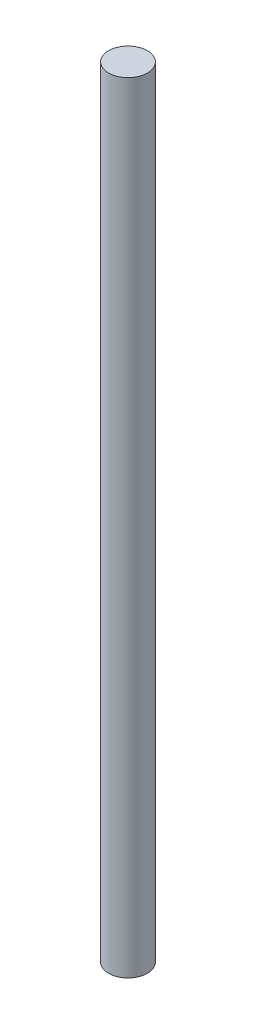
ISO-10303-21;
HEADER;
FILE_DESCRIPTION(('STEP AP214'),'2;1');
FILE_NAME('part.step','',(''),(''),'','','');
FILE_SCHEMA(('AUTOMOTIVE_DESIGN { 1 0 10303 214 1 1 1 1 }'));
ENDSEC;
DATA;
#1=APPLICATION_CONTEXT('core data for automotive mechanical design processes');
#2=APPLICATION_PROTOCOL_DEFINITION('international standard','automotive_design',2000,#1);
#3=PRODUCT_CONTEXT('',#1,'mechanical');
#4=PRODUCT('Part','Part','',(#3));
#5=PRODUCT_RELATED_PRODUCT_CATEGORY('part','',(#4));
#6=PRODUCT_DEFINITION_FORMATION('','',#4);
#7=PRODUCT_DEFINITION_CONTEXT('part definition',#1,'design');
#8=PRODUCT_DEFINITION('design','',#6,#7);
#9=PRODUCT_DEFINITION_SHAPE('','',#8);
#10=(LENGTH_UNIT() NAMED_UNIT(*) SI_UNIT(.MILLI.,.METRE.));
#11=(NAMED_UNIT(*) PLANE_ANGLE_UNIT() SI_UNIT($,.RADIAN.));
#12=(NAMED_UNIT(*) SI_UNIT($,.STERADIAN.) SOLID_ANGLE_UNIT());
#13=UNCERTAINTY_MEASURE_WITH_UNIT(LENGTH_MEASURE(1.E-05),#10,'distance_accuracy_value','');
#14=(GEOMETRIC_REPRESENTATION_CONTEXT(3) GLOBAL_UNCERTAINTY_ASSIGNED_CONTEXT((#13)) GLOBAL_UNIT_ASSIGNED_CONTEXT((#10,
#11,#12)) REPRESENTATION_CONTEXT('',''));
#15=CARTESIAN_POINT('',(0.,0.,0.));
#16=DIRECTION('',(0.,0.,1.));
#17=DIRECTION('',(1.,0.,0.));
#18=AXIS2_PLACEMENT_3D('',#15,#16,#17);
#19=CARTESIAN_POINT('',(0.,-200.,0.));
#20=DIRECTION('',(0.,1.,0.));
#21=DIRECTION('',(0.,0.,1.));
#22=AXIS2_PLACEMENT_3D('',#19,#20,#21);
#23=CYLINDRICAL_SURFACE('',#22,4.975);
#24=CARTESIAN_POINT('',(0.,-200.,0.));
#25=DIRECTION('',(0.,1.,0.));
#26=DIRECTION('',(0.,0.,1.));
#27=AXIS2_PLACEMENT_3D('',#24,#25,#26);
#28=CIRCLE('',#27,4.975);
#29=CARTESIAN_POINT('',(0.,-200.,4.975));
#30=VERTEX_POINT('',#29);
#31=EDGE_CURVE('E10',#30,#30,#28,.T.);
#32=ORIENTED_EDGE('',*,*,#31,.T.);
#33=EDGE_LOOP('',(#32));
#34=FACE_BOUND('',#33,.T.);
#35=CARTESIAN_POINT('',(0.,0.,0.));
#36=DIRECTION('',(0.,1.,0.));
#37=DIRECTION('',(0.,0.,1.));
#38=AXIS2_PLACEMENT_3D('',#35,#36,#37);
#39=CIRCLE('',#38,4.975);
#40=CARTESIAN_POINT('',(0.,0.,4.975));
#41=VERTEX_POINT('',#40);
#42=EDGE_CURVE('E34',#41,#41,#39,.T.);
#43=ORIENTED_EDGE('',*,*,#42,.F.);
#44=EDGE_LOOP('',(#43));
#45=FACE_BOUND('',#44,.T.);
#46=ADVANCED_FACE('F31',(#34,#45),#23,.T.);
#47=CARTESIAN_POINT('',(0.,-200.,0.));
#48=DIRECTION('',(0.,1.,0.));
#49=DIRECTION('',(0.,0.,1.));
#50=AXIS2_PLACEMENT_3D('',#47,#48,#49);
#51=PLANE('',#50);
#52=ORIENTED_EDGE('',*,*,#31,.F.);
#53=EDGE_LOOP('',(#52));
#54=FACE_BOUND('',#53,.T.);
#55=ADVANCED_FACE('F46',(#54),#51,.F.);
#56=CARTESIAN_POINT('',(0.,0.,0.));
#57=DIRECTION('',(0.,1.,0.));
#58=DIRECTION('',(0.,0.,1.));
#59=AXIS2_PLACEMENT_3D('',#56,#57,#58);
#60=PLANE('',#59);
#61=ORIENTED_EDGE('',*,*,#42,.T.);
#62=EDGE_LOOP('',(#61));
#63=FACE_BOUND('',#62,.T.);
#64=ADVANCED_FACE('F43',(#63),#60,.T.);
#65=CLOSED_SHELL('',(#46,#55,#64));
#66=MANIFOLD_SOLID_BREP('B2',#65);
#67=ADVANCED_BREP_SHAPE_REPRESENTATION('',(#18,#66),#14);
#68=SHAPE_DEFINITION_REPRESENTATION(#9,#67);
ENDSEC;
END-ISO-10303-21;
